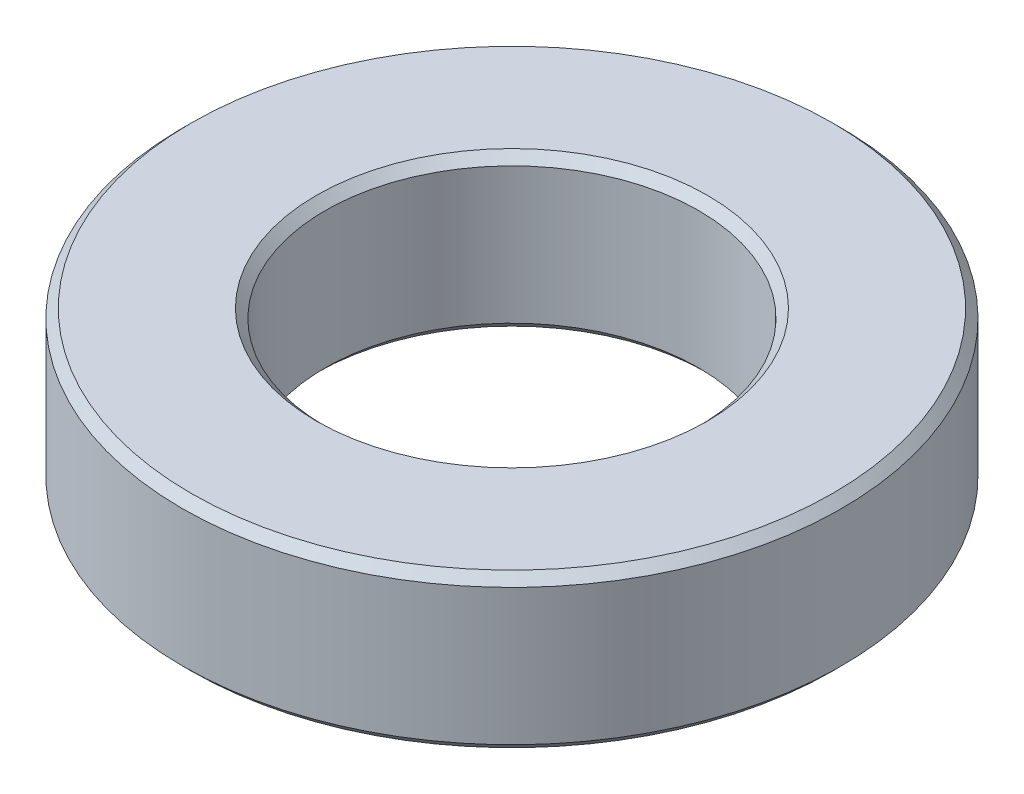
ISO-10303-21;
HEADER;
FILE_DESCRIPTION(('STEP AP214'),'2;1');
FILE_NAME('part.step','',(''),(''),'','','');
FILE_SCHEMA(('AUTOMOTIVE_DESIGN { 1 0 10303 214 1 1 1 1 }'));
ENDSEC;
DATA;
#1=APPLICATION_CONTEXT('core data for automotive mechanical design processes');
#2=APPLICATION_PROTOCOL_DEFINITION('international standard','automotive_design',2000,#1);
#3=PRODUCT_CONTEXT('',#1,'mechanical');
#4=PRODUCT('Part','Part','',(#3));
#5=PRODUCT_RELATED_PRODUCT_CATEGORY('part','',(#4));
#6=PRODUCT_DEFINITION_FORMATION('','',#4);
#7=PRODUCT_DEFINITION_CONTEXT('part definition',#1,'design');
#8=PRODUCT_DEFINITION('design','',#6,#7);
#9=PRODUCT_DEFINITION_SHAPE('','',#8);
#10=(LENGTH_UNIT() NAMED_UNIT(*) SI_UNIT(.MILLI.,.METRE.));
#11=(NAMED_UNIT(*) PLANE_ANGLE_UNIT() SI_UNIT($,.RADIAN.));
#12=(NAMED_UNIT(*) SI_UNIT($,.STERADIAN.) SOLID_ANGLE_UNIT());
#13=UNCERTAINTY_MEASURE_WITH_UNIT(LENGTH_MEASURE(1.E-05),#10,'distance_accuracy_value','');
#14=(GEOMETRIC_REPRESENTATION_CONTEXT(3) GLOBAL_UNCERTAINTY_ASSIGNED_CONTEXT((#13)) GLOBAL_UNIT_ASSIGNED_CONTEXT((#10,
#11,#12)) REPRESENTATION_CONTEXT('',''));
#15=CARTESIAN_POINT('',(0.,0.,0.));
#16=DIRECTION('',(0.,0.,1.));
#17=DIRECTION('',(1.,0.,0.));
#18=AXIS2_PLACEMENT_3D('',#15,#16,#17);
#19=CARTESIAN_POINT('',(0.,7.,0.));
#20=DIRECTION('',(0.,1.,0.));
#21=DIRECTION('',(0.,0.,1.));
#22=AXIS2_PLACEMENT_3D('',#19,#20,#21);
#23=PLANE('',#22);
#24=CARTESIAN_POINT('',(0.,7.,0.));
#25=DIRECTION('',(0.,1.,0.));
#26=DIRECTION('',(0.,0.,1.));
#27=AXIS2_PLACEMENT_3D('',#24,#25,#26);
#28=CIRCLE('',#27,8.9);
#29=CARTESIAN_POINT('',(0.,7.,8.9));
#30=VERTEX_POINT('',#29);
#31=EDGE_CURVE('E63',#30,#30,#28,.F.);
#32=ORIENTED_EDGE('',*,*,#31,.T.);
#33=EDGE_LOOP('',(#32));
#34=FACE_BOUND('',#33,.T.);
#35=CARTESIAN_POINT('',(0.,7.,0.));
#36=DIRECTION('',(0.,1.,0.));
#37=DIRECTION('',(0.,0.,1.));
#38=AXIS2_PLACEMENT_3D('',#35,#36,#37);
#39=CIRCLE('',#38,14.6);
#40=CARTESIAN_POINT('',(0.,7.,14.6));
#41=VERTEX_POINT('',#40);
#42=EDGE_CURVE('E68',#41,#41,#39,.T.);
#43=ORIENTED_EDGE('',*,*,#42,.T.);
#44=EDGE_LOOP('',(#43));
#45=FACE_BOUND('',#44,.T.);
#46=ADVANCED_FACE('F49',(#34,#45),#23,.T.);
#47=CARTESIAN_POINT('',(0.,0.,0.));
#48=DIRECTION('',(0.,1.,0.));
#49=DIRECTION('',(0.,0.,1.));
#50=AXIS2_PLACEMENT_3D('',#47,#48,#49);
#51=PLANE('',#50);
#52=CARTESIAN_POINT('',(0.,0.,0.));
#53=DIRECTION('',(0.,1.,0.));
#54=DIRECTION('',(0.,0.,1.));
#55=AXIS2_PLACEMENT_3D('',#52,#53,#54);
#56=CIRCLE('',#55,8.9);
#57=CARTESIAN_POINT('',(0.,0.,8.9));
#58=VERTEX_POINT('',#57);
#59=EDGE_CURVE('E82',#58,#58,#56,.T.);
#60=ORIENTED_EDGE('',*,*,#59,.T.);
#61=EDGE_LOOP('',(#60));
#62=FACE_BOUND('',#61,.T.);
#63=CARTESIAN_POINT('',(0.,0.,0.));
#64=DIRECTION('',(0.,1.,0.));
#65=DIRECTION('',(0.,0.,1.));
#66=AXIS2_PLACEMENT_3D('',#63,#64,#65);
#67=CIRCLE('',#66,14.6);
#68=CARTESIAN_POINT('',(0.,0.,14.6));
#69=VERTEX_POINT('',#68);
#70=EDGE_CURVE('E86',#69,#69,#67,.F.);
#71=ORIENTED_EDGE('',*,*,#70,.T.);
#72=EDGE_LOOP('',(#71));
#73=FACE_BOUND('',#72,.T.);
#74=ADVANCED_FACE('F91',(#62,#73),#51,.F.);
#75=CARTESIAN_POINT('',(0.,7.,0.));
#76=DIRECTION('',(0.,-1.,0.));
#77=DIRECTION('',(0.,0.,-1.));
#78=AXIS2_PLACEMENT_3D('',#75,#76,#77);
#79=CYLINDRICAL_SURFACE('',#78,15.);
#80=CARTESIAN_POINT('',(0.,0.399999999999996,0.));
#81=DIRECTION('',(0.,1.,0.));
#82=DIRECTION('',(0.,0.,1.));
#83=AXIS2_PLACEMENT_3D('',#80,#81,#82);
#84=CIRCLE('',#83,15.);
#85=CARTESIAN_POINT('',(0.,0.399999999999996,15.));
#86=VERTEX_POINT('',#85);
#87=EDGE_CURVE('E10',#86,#86,#84,.T.);
#88=ORIENTED_EDGE('',*,*,#87,.T.);
#89=EDGE_LOOP('',(#88));
#90=FACE_BOUND('',#89,.T.);
#91=CARTESIAN_POINT('',(0.,6.6,0.));
#92=DIRECTION('',(0.,1.,0.));
#93=DIRECTION('',(0.,0.,1.));
#94=AXIS2_PLACEMENT_3D('',#91,#92,#93);
#95=CIRCLE('',#94,15.);
#96=CARTESIAN_POINT('',(0.,6.6,15.));
#97=VERTEX_POINT('',#96);
#98=EDGE_CURVE('E58',#97,#97,#95,.F.);
#99=ORIENTED_EDGE('',*,*,#98,.T.);
#100=EDGE_LOOP('',(#99));
#101=FACE_BOUND('',#100,.T.);
#102=ADVANCED_FACE('F111',(#90,#101),#79,.T.);
#103=CARTESIAN_POINT('',(0.,7.,0.));
#104=DIRECTION('',(0.,-1.,0.));
#105=DIRECTION('',(0.,0.,-1.));
#106=AXIS2_PLACEMENT_3D('',#103,#104,#105);
#107=CYLINDRICAL_SURFACE('',#106,8.5);
#108=CARTESIAN_POINT('',(0.,0.399999999999998,0.));
#109=DIRECTION('',(0.,1.,0.));
#110=DIRECTION('',(0.,0.,1.));
#111=AXIS2_PLACEMENT_3D('',#108,#109,#110);
#112=CIRCLE('',#111,8.5);
#113=CARTESIAN_POINT('',(0.,0.399999999999998,8.5));
#114=VERTEX_POINT('',#113);
#115=EDGE_CURVE('E74',#114,#114,#112,.F.);
#116=ORIENTED_EDGE('',*,*,#115,.T.);
#117=EDGE_LOOP('',(#116));
#118=FACE_BOUND('',#117,.T.);
#119=CARTESIAN_POINT('',(0.,6.60000000000001,0.));
#120=DIRECTION('',(0.,1.,0.));
#121=DIRECTION('',(0.,0.,1.));
#122=AXIS2_PLACEMENT_3D('',#119,#120,#121);
#123=CIRCLE('',#122,8.5);
#124=CARTESIAN_POINT('',(0.,6.60000000000001,8.5));
#125=VERTEX_POINT('',#124);
#126=EDGE_CURVE('E78',#125,#125,#123,.T.);
#127=ORIENTED_EDGE('',*,*,#126,.T.);
#128=EDGE_LOOP('',(#127));
#129=FACE_BOUND('',#128,.T.);
#130=ADVANCED_FACE('F116',(#118,#129),#107,.F.);
#131=CARTESIAN_POINT('',(0.,0.,0.));
#132=DIRECTION('',(0.,-1.,0.));
#133=DIRECTION('',(0.,0.,-1.));
#134=AXIS2_PLACEMENT_3D('',#131,#132,#133);
#135=CONICAL_SURFACE('',#134,8.9,0.785398163397444);
#136=ORIENTED_EDGE('',*,*,#115,.F.);
#137=EDGE_LOOP('',(#136));
#138=FACE_BOUND('',#137,.T.);
#139=ORIENTED_EDGE('',*,*,#59,.F.);
#140=EDGE_LOOP('',(#139));
#141=FACE_BOUND('',#140,.T.);
#142=ADVANCED_FACE('F101',(#138,#141),#135,.F.);
#143=CARTESIAN_POINT('',(0.,6.60000000000001,0.));
#144=DIRECTION('',(0.,1.,0.));
#145=DIRECTION('',(0.,0.,1.));
#146=AXIS2_PLACEMENT_3D('',#143,#144,#145);
#147=CONICAL_SURFACE('',#146,8.5,0.785398163397461);
#148=CARTESIAN_POINT('',(0.,7.,8.9));
#149=CARTESIAN_POINT('',(0.,6.99583333333333,8.89583333333333));
#150=CARTESIAN_POINT('',(0.,6.99166666666667,8.89166666666666));
#151=CARTESIAN_POINT('',(0.,6.98333333333333,8.88333333333333));
#152=CARTESIAN_POINT('',(0.,6.97916666666667,8.87916666666666));
#153=CARTESIAN_POINT('',(0.,6.97083333333333,8.87083333333333));
#154=CARTESIAN_POINT('',(0.,6.96666666666667,8.86666666666667));
#155=CARTESIAN_POINT('',(0.,6.95833333333333,8.85833333333333));
#156=CARTESIAN_POINT('',(0.,6.95416666666667,8.85416666666666));
#157=CARTESIAN_POINT('',(0.,6.94583333333334,8.84583333333333));
#158=CARTESIAN_POINT('',(0.,6.94166666666667,8.84166666666667));
#159=CARTESIAN_POINT('',(0.,6.93333333333334,8.83333333333333));
#160=CARTESIAN_POINT('',(0.,6.92916666666667,8.82916666666666));
#161=CARTESIAN_POINT('',(0.,6.92083333333334,8.82083333333333));
#162=CARTESIAN_POINT('',(0.,6.91666666666667,8.81666666666666));
#163=CARTESIAN_POINT('',(0.,6.90833333333334,8.80833333333333));
#164=CARTESIAN_POINT('',(0.,6.90416666666667,8.80416666666667));
#165=CARTESIAN_POINT('',(0.,6.89583333333334,8.79583333333333));
#166=CARTESIAN_POINT('',(0.,6.89166666666667,8.79166666666666));
#167=CARTESIAN_POINT('',(0.,6.88333333333334,8.78333333333333));
#168=CARTESIAN_POINT('',(0.,6.87916666666667,8.77916666666667));
#169=CARTESIAN_POINT('',(0.,6.87083333333334,8.77083333333333));
#170=CARTESIAN_POINT('',(0.,6.86666666666667,8.76666666666667));
#171=CARTESIAN_POINT('',(0.,6.85833333333334,8.75833333333333));
#172=CARTESIAN_POINT('',(0.,6.85416666666667,8.75416666666666));
#173=CARTESIAN_POINT('',(0.,6.84583333333334,8.74583333333333));
#174=CARTESIAN_POINT('',(0.,6.84166666666667,8.74166666666667));
#175=CARTESIAN_POINT('',(0.,6.83333333333334,8.73333333333333));
#176=CARTESIAN_POINT('',(0.,6.82916666666667,8.72916666666666));
#177=CARTESIAN_POINT('',(0.,6.82083333333334,8.72083333333333));
#178=CARTESIAN_POINT('',(0.,6.81666666666667,8.71666666666667));
#179=CARTESIAN_POINT('',(0.,6.80833333333334,8.70833333333333));
#180=CARTESIAN_POINT('',(0.,6.80416666666667,8.70416666666667));
#181=CARTESIAN_POINT('',(0.,6.79583333333334,8.69583333333333));
#182=CARTESIAN_POINT('',(0.,6.79166666666667,8.69166666666666));
#183=CARTESIAN_POINT('',(0.,6.78333333333334,8.68333333333333));
#184=CARTESIAN_POINT('',(0.,6.77916666666667,8.67916666666667));
#185=CARTESIAN_POINT('',(0.,6.77083333333334,8.67083333333333));
#186=CARTESIAN_POINT('',(0.,6.76666666666667,8.66666666666667));
#187=CARTESIAN_POINT('',(0.,6.75833333333334,8.65833333333333));
#188=CARTESIAN_POINT('',(0.,6.75416666666667,8.65416666666667));
#189=CARTESIAN_POINT('',(0.,6.74583333333334,8.64583333333333));
#190=CARTESIAN_POINT('',(0.,6.74166666666667,8.64166666666667));
#191=CARTESIAN_POINT('',(0.,6.73333333333334,8.63333333333333));
#192=CARTESIAN_POINT('',(0.,6.72916666666668,8.62916666666666));
#193=CARTESIAN_POINT('',(0.,6.72083333333334,8.62083333333333));
#194=CARTESIAN_POINT('',(0.,6.71666666666668,8.61666666666667));
#195=CARTESIAN_POINT('',(0.,6.70833333333334,8.60833333333333));
#196=CARTESIAN_POINT('',(0.,6.70416666666668,8.60416666666667));
#197=CARTESIAN_POINT('',(0.,6.69583333333334,8.59583333333333));
#198=CARTESIAN_POINT('',(0.,6.69166666666668,8.59166666666667));
#199=CARTESIAN_POINT('',(0.,6.68333333333334,8.58333333333333));
#200=CARTESIAN_POINT('',(0.,6.67916666666668,8.57916666666667));
#201=CARTESIAN_POINT('',(0.,6.67083333333334,8.57083333333333));
#202=CARTESIAN_POINT('',(0.,6.66666666666668,8.56666666666667));
#203=CARTESIAN_POINT('',(0.,6.65833333333334,8.55833333333333));
#204=CARTESIAN_POINT('',(0.,6.65416666666668,8.55416666666667));
#205=CARTESIAN_POINT('',(0.,6.64583333333334,8.54583333333333));
#206=CARTESIAN_POINT('',(0.,6.64166666666668,8.54166666666667));
#207=CARTESIAN_POINT('',(0.,6.63333333333335,8.53333333333333));
#208=CARTESIAN_POINT('',(0.,6.62916666666668,8.52916666666667));
#209=CARTESIAN_POINT('',(0.,6.62083333333335,8.52083333333333));
#210=CARTESIAN_POINT('',(0.,6.61666666666668,8.51666666666667));
#211=CARTESIAN_POINT('',(0.,6.60833333333335,8.50833333333333));
#212=CARTESIAN_POINT('',(0.,6.60416666666668,8.50416666666667));
#213=CARTESIAN_POINT('',(0.,6.60000000000001,8.5));
#214=B_SPLINE_CURVE_WITH_KNOTS('',3,(#148,#149,#150,#151,#152,#153,#154,#155,#156,#157,#158,
#159,#160,#161,#162,#163,#164,#165,#166,#167,#168,#169,#170,#171,#172,#173,#174,#175,#176,#177,
#178,#179,#180,#181,#182,#183,#184,#185,#186,#187,#188,#189,#190,#191,#192,#193,#194,#195,#196,
#197,#198,#199,#200,#201,#202,#203,#204,#205,#206,#207,#208,#209,#210,#211,#212,#213),
.UNSPECIFIED.,.F.,.F.,(4,2,2,2,2,2,2,2,2,2,2,2,2,2,2,2,2,2,2,2,2,2,2,2,2,2,2,2,2,2,2,2,4),(0.,
0.0176776695296642,0.0353553390593278,0.0530330085889901,0.0707106781186537,0.0883883476483173,
0.106066017177981,0.123743686707643,0.141421356237307,0.159099025766971,0.176776695296635,
0.194454364826297,0.212132034355961,0.229809703885624,0.247487373415288,0.26516504294495,
0.282842712474614,0.300520382004278,0.318198051533941,0.335875721063604,0.353553390593267,
0.371231060122931,0.388908729652595,0.406586399182257,0.424264068711921,0.441941738241585,
0.459619407771248,0.477297077300911,0.494974746830574,0.512652416360238,0.530330085889901,
0.548007755419565,0.565685424949227),.UNSPECIFIED.);
#215=EDGE_CURVE('BSEAM96',#30,#125,#214,.T.);
#216=ORIENTED_EDGE('',*,*,#31,.F.);
#217=ORIENTED_EDGE('',*,*,#126,.F.);
#218=ORIENTED_EDGE('',*,*,#215,.T.);
#219=ORIENTED_EDGE('',*,*,#215,.F.);
#220=EDGE_LOOP('',(#216,#218,#217,#219));
#221=FACE_BOUND('',#220,.T.);
#222=ADVANCED_FACE('F96',(#221),#147,.F.);
#223=CARTESIAN_POINT('',(0.,0.399999999999996,0.));
#224=DIRECTION('',(0.,1.,0.));
#225=DIRECTION('',(0.,0.,1.));
#226=AXIS2_PLACEMENT_3D('',#223,#224,#225);
#227=CONICAL_SURFACE('',#226,15.,0.785398163397453);
#228=ORIENTED_EDGE('',*,*,#70,.F.);
#229=EDGE_LOOP('',(#228));
#230=FACE_BOUND('',#229,.T.);
#231=ORIENTED_EDGE('',*,*,#87,.F.);
#232=EDGE_LOOP('',(#231));
#233=FACE_BOUND('',#232,.T.);
#234=ADVANCED_FACE('F93',(#230,#233),#227,.T.);
#235=CARTESIAN_POINT('',(0.,7.,0.));
#236=DIRECTION('',(0.,-1.,0.));
#237=DIRECTION('',(0.,0.,-1.));
#238=AXIS2_PLACEMENT_3D('',#235,#236,#237);
#239=CONICAL_SURFACE('',#238,14.6,0.785398163397448);
#240=ORIENTED_EDGE('',*,*,#98,.F.);
#241=EDGE_LOOP('',(#240));
#242=FACE_BOUND('',#241,.T.);
#243=ORIENTED_EDGE('',*,*,#42,.F.);
#244=EDGE_LOOP('',(#243));
#245=FACE_BOUND('',#244,.T.);
#246=ADVANCED_FACE('F52',(#242,#245),#239,.T.);
#247=CLOSED_SHELL('',(#46,#74,#102,#130,#142,#222,#234,#246));
#248=MANIFOLD_SOLID_BREP('B2',#247);
#249=ADVANCED_BREP_SHAPE_REPRESENTATION('',(#18,#248),#14);
#250=SHAPE_DEFINITION_REPRESENTATION(#9,#249);
ENDSEC;
END-ISO-10303-21;
